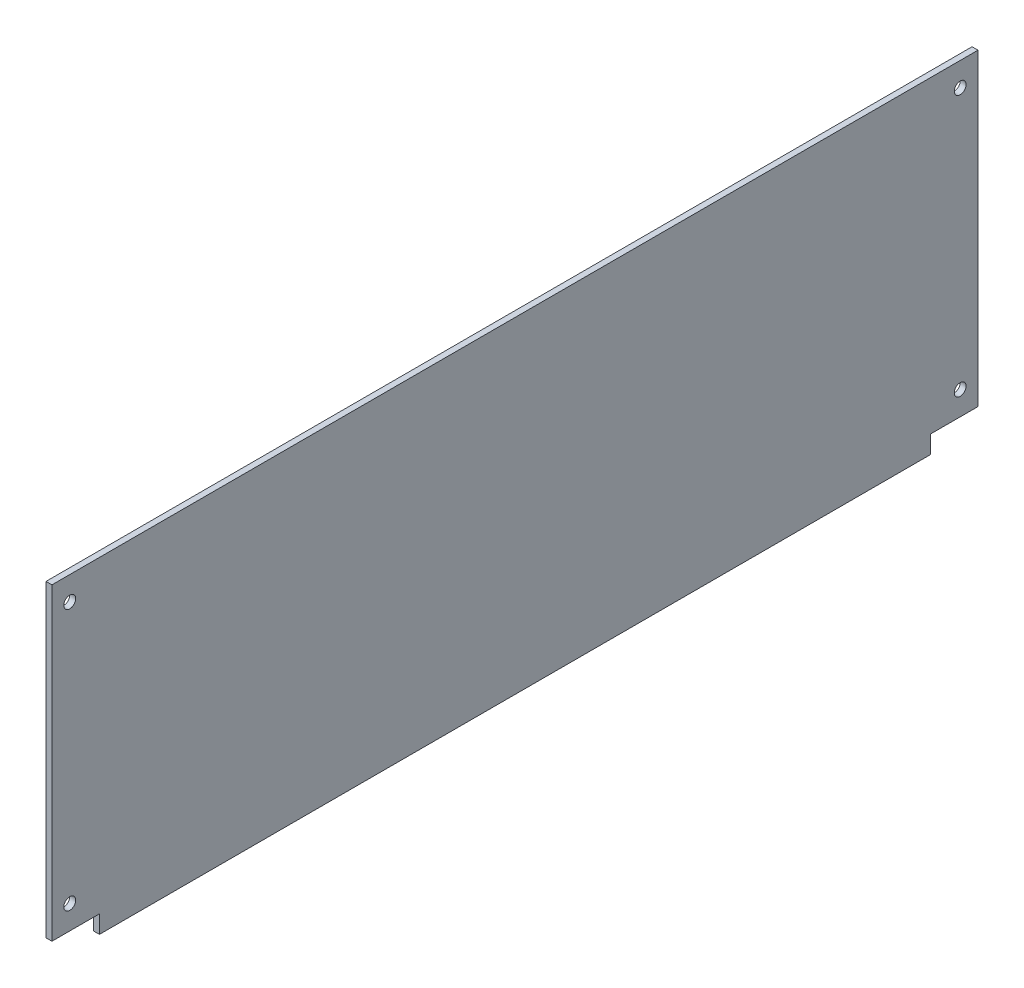
ISO-10303-21;
HEADER;
FILE_DESCRIPTION(('STEP AP214'),'2;1');
FILE_NAME('part.step','',(''),(''),'','','');
FILE_SCHEMA(('AUTOMOTIVE_DESIGN { 1 0 10303 214 1 1 1 1 }'));
ENDSEC;
DATA;
#1=APPLICATION_CONTEXT('core data for automotive mechanical design processes');
#2=APPLICATION_PROTOCOL_DEFINITION('international standard','automotive_design',2000,#1);
#3=PRODUCT_CONTEXT('',#1,'mechanical');
#4=PRODUCT('Part','Part','',(#3));
#5=PRODUCT_RELATED_PRODUCT_CATEGORY('part','',(#4));
#6=PRODUCT_DEFINITION_FORMATION('','',#4);
#7=PRODUCT_DEFINITION_CONTEXT('part definition',#1,'design');
#8=PRODUCT_DEFINITION('design','',#6,#7);
#9=PRODUCT_DEFINITION_SHAPE('','',#8);
#10=(LENGTH_UNIT() NAMED_UNIT(*) SI_UNIT(.MILLI.,.METRE.));
#11=(NAMED_UNIT(*) PLANE_ANGLE_UNIT() SI_UNIT($,.RADIAN.));
#12=(NAMED_UNIT(*) SI_UNIT($,.STERADIAN.) SOLID_ANGLE_UNIT());
#13=UNCERTAINTY_MEASURE_WITH_UNIT(LENGTH_MEASURE(1.E-05),#10,'distance_accuracy_value','');
#14=(GEOMETRIC_REPRESENTATION_CONTEXT(3) GLOBAL_UNCERTAINTY_ASSIGNED_CONTEXT((#13)) GLOBAL_UNIT_ASSIGNED_CONTEXT((#10,
#11,#12)) REPRESENTATION_CONTEXT('',''));
#15=CARTESIAN_POINT('',(0.,0.,0.));
#16=DIRECTION('',(0.,0.,1.));
#17=DIRECTION('',(1.,0.,0.));
#18=AXIS2_PLACEMENT_3D('',#15,#16,#17);
#19=CARTESIAN_POINT('',(5.,0.,700.));
#20=DIRECTION('',(0.,1.,0.));
#21=DIRECTION('',(0.,0.,1.));
#22=AXIS2_PLACEMENT_3D('',#19,#20,#21);
#23=PLANE('',#22);
#24=DIRECTION('',(1.,0.,0.));
#25=VECTOR('',#24,1.);
#26=CARTESIAN_POINT('',(5.,0.,0.));
#27=LINE('',#26,#25);
#28=CARTESIAN_POINT('',(0.,0.,0.));
#29=VERTEX_POINT('',#28);
#30=CARTESIAN_POINT('',(5.,0.,0.));
#31=VERTEX_POINT('',#30);
#32=EDGE_CURVE('E139',#29,#31,#27,.T.);
#33=ORIENTED_EDGE('',*,*,#32,.T.);
#34=DIRECTION('',(0.,0.,-1.));
#35=VECTOR('',#34,1.);
#36=CARTESIAN_POINT('',(5.,0.,700.));
#37=LINE('',#36,#35);
#38=CARTESIAN_POINT('',(5.,0.,700.));
#39=VERTEX_POINT('',#38);
#40=EDGE_CURVE('E11',#39,#31,#37,.T.);
#41=ORIENTED_EDGE('',*,*,#40,.F.);
#42=DIRECTION('',(1.,0.,0.));
#43=VECTOR('',#42,1.);
#44=CARTESIAN_POINT('',(5.,0.,700.));
#45=LINE('',#44,#43);
#46=CARTESIAN_POINT('',(0.,0.,700.));
#47=VERTEX_POINT('',#46);
#48=EDGE_CURVE('E141',#47,#39,#45,.T.);
#49=ORIENTED_EDGE('',*,*,#48,.F.);
#50=DIRECTION('',(0.,0.,-1.));
#51=VECTOR('',#50,1.);
#52=CARTESIAN_POINT('',(0.,0.,700.));
#53=LINE('',#52,#51);
#54=EDGE_CURVE('E150',#47,#29,#53,.T.);
#55=ORIENTED_EDGE('',*,*,#54,.T.);
#56=EDGE_LOOP('',(#33,#41,#49,#55));
#57=FACE_BOUND('',#56,.T.);
#58=ADVANCED_FACE('F35',(#57),#23,.F.);
#59=CARTESIAN_POINT('',(5.,0.,700.));
#60=DIRECTION('',(-1.,0.,0.));
#61=DIRECTION('',(0.,0.,1.));
#62=AXIS2_PLACEMENT_3D('',#59,#60,#61);
#63=PLANE('',#62);
#64=CARTESIAN_POINT('',(5.,255.,725.));
#65=DIRECTION('',(1.,0.,0.));
#66=DIRECTION('',(0.,0.,-1.));
#67=AXIS2_PLACEMENT_3D('',#64,#65,#66);
#68=CIRCLE('',#67,5.);
#69=CARTESIAN_POINT('',(5.,255.,720.));
#70=VERTEX_POINT('',#69);
#71=EDGE_CURVE('E188',#70,#70,#68,.T.);
#72=ORIENTED_EDGE('',*,*,#71,.F.);
#73=EDGE_LOOP('',(#72));
#74=FACE_BOUND('',#73,.T.);
#75=CARTESIAN_POINT('',(5.,35.,725.));
#76=DIRECTION('',(1.,0.,0.));
#77=DIRECTION('',(0.,0.,-1.));
#78=AXIS2_PLACEMENT_3D('',#75,#76,#77);
#79=CIRCLE('',#78,5.);
#80=CARTESIAN_POINT('',(5.,35.,720.));
#81=VERTEX_POINT('',#80);
#82=EDGE_CURVE('E199',#81,#81,#79,.T.);
#83=ORIENTED_EDGE('',*,*,#82,.F.);
#84=EDGE_LOOP('',(#83));
#85=FACE_BOUND('',#84,.T.);
#86=CARTESIAN_POINT('',(5.,255.,-25.));
#87=DIRECTION('',(-1.,0.,0.));
#88=DIRECTION('',(0.,0.,1.));
#89=AXIS2_PLACEMENT_3D('',#86,#87,#88);
#90=CIRCLE('',#89,5.);
#91=CARTESIAN_POINT('',(5.,255.,-20.));
#92=VERTEX_POINT('',#91);
#93=EDGE_CURVE('E182',#92,#92,#90,.T.);
#94=ORIENTED_EDGE('',*,*,#93,.T.);
#95=EDGE_LOOP('',(#94));
#96=FACE_BOUND('',#95,.T.);
#97=CARTESIAN_POINT('',(5.,35.,-25.));
#98=DIRECTION('',(-1.,0.,0.));
#99=DIRECTION('',(0.,0.,1.));
#100=AXIS2_PLACEMENT_3D('',#97,#98,#99);
#101=CIRCLE('',#100,5.);
#102=CARTESIAN_POINT('',(5.,35.,-20.));
#103=VERTEX_POINT('',#102);
#104=EDGE_CURVE('E187',#103,#103,#101,.T.);
#105=ORIENTED_EDGE('',*,*,#104,.T.);
#106=EDGE_LOOP('',(#105));
#107=FACE_BOUND('',#106,.T.);
#108=DIRECTION('',(0.,1.,0.));
#109=VECTOR('',#108,1.);
#110=CARTESIAN_POINT('',(5.,0.,0.));
#111=LINE('',#110,#109);
#112=CARTESIAN_POINT('',(5.,15.,0.));
#113=VERTEX_POINT('',#112);
#114=EDGE_CURVE('E153',#31,#113,#111,.T.);
#115=ORIENTED_EDGE('',*,*,#114,.T.);
#116=DIRECTION('',(0.,0.,1.));
#117=VECTOR('',#116,1.);
#118=CARTESIAN_POINT('',(5.,15.,0.));
#119=LINE('',#118,#117);
#120=CARTESIAN_POINT('',(5.,15.,-40.));
#121=VERTEX_POINT('',#120);
#122=EDGE_CURVE('E128',#121,#113,#119,.T.);
#123=ORIENTED_EDGE('',*,*,#122,.F.);
#124=DIRECTION('',(0.,-1.,0.));
#125=VECTOR('',#124,1.);
#126=CARTESIAN_POINT('',(5.,275.,-40.));
#127=LINE('',#126,#125);
#128=CARTESIAN_POINT('',(5.,275.,-40.));
#129=VERTEX_POINT('',#128);
#130=EDGE_CURVE('E106',#129,#121,#127,.T.);
#131=ORIENTED_EDGE('',*,*,#130,.F.);
#132=DIRECTION('',(0.,0.,-1.));
#133=VECTOR('',#132,1.);
#134=CARTESIAN_POINT('',(5.,275.,700.));
#135=LINE('',#134,#133);
#136=CARTESIAN_POINT('',(5.,275.,740.));
#137=VERTEX_POINT('',#136);
#138=EDGE_CURVE('E42',#137,#129,#135,.T.);
#139=ORIENTED_EDGE('',*,*,#138,.F.);
#140=DIRECTION('',(0.,-1.,0.));
#141=VECTOR('',#140,1.);
#142=CARTESIAN_POINT('',(5.,275.,740.));
#143=LINE('',#142,#141);
#144=CARTESIAN_POINT('',(5.,15.,740.));
#145=VERTEX_POINT('',#144);
#146=EDGE_CURVE('E103',#137,#145,#143,.T.);
#147=ORIENTED_EDGE('',*,*,#146,.T.);
#148=DIRECTION('',(0.,0.,-1.));
#149=VECTOR('',#148,1.);
#150=CARTESIAN_POINT('',(5.,15.,700.));
#151=LINE('',#150,#149);
#152=CARTESIAN_POINT('',(5.,15.,700.));
#153=VERTEX_POINT('',#152);
#154=EDGE_CURVE('E174',#145,#153,#151,.T.);
#155=ORIENTED_EDGE('',*,*,#154,.T.);
#156=DIRECTION('',(0.,1.,0.));
#157=VECTOR('',#156,1.);
#158=CARTESIAN_POINT('',(5.,0.,700.));
#159=LINE('',#158,#157);
#160=EDGE_CURVE('E144',#39,#153,#159,.T.);
#161=ORIENTED_EDGE('',*,*,#160,.F.);
#162=ORIENTED_EDGE('',*,*,#40,.T.);
#163=EDGE_LOOP('',(#115,#123,#131,#139,#147,#155,#161,#162));
#164=FACE_BOUND('',#163,.T.);
#165=ADVANCED_FACE('F101',(#74,#85,#96,#107,#164),#63,.F.);
#166=CARTESIAN_POINT('',(5.,275.,700.));
#167=DIRECTION('',(0.,-1.,0.));
#168=DIRECTION('',(0.,0.,-1.));
#169=AXIS2_PLACEMENT_3D('',#166,#167,#168);
#170=PLANE('',#169);
#171=ORIENTED_EDGE('',*,*,#138,.T.);
#172=DIRECTION('',(1.,0.,0.));
#173=VECTOR('',#172,1.);
#174=CARTESIAN_POINT('',(5.,275.,-40.));
#175=LINE('',#174,#173);
#176=CARTESIAN_POINT('',(0.,275.,-40.));
#177=VERTEX_POINT('',#176);
#178=EDGE_CURVE('E125',#177,#129,#175,.T.);
#179=ORIENTED_EDGE('',*,*,#178,.F.);
#180=DIRECTION('',(0.,0.,-1.));
#181=VECTOR('',#180,1.);
#182=CARTESIAN_POINT('',(0.,275.,700.));
#183=LINE('',#182,#181);
#184=CARTESIAN_POINT('',(0.,275.,740.));
#185=VERTEX_POINT('',#184);
#186=EDGE_CURVE('E110',#185,#177,#183,.T.);
#187=ORIENTED_EDGE('',*,*,#186,.F.);
#188=DIRECTION('',(1.,0.,0.));
#189=VECTOR('',#188,1.);
#190=CARTESIAN_POINT('',(5.,275.,740.));
#191=LINE('',#190,#189);
#192=EDGE_CURVE('E112',#185,#137,#191,.T.);
#193=ORIENTED_EDGE('',*,*,#192,.T.);
#194=EDGE_LOOP('',(#171,#179,#187,#193));
#195=FACE_BOUND('',#194,.T.);
#196=ADVANCED_FACE('F113',(#195),#170,.F.);
#197=CARTESIAN_POINT('',(0.,0.,700.));
#198=DIRECTION('',(1.,0.,0.));
#199=DIRECTION('',(0.,0.,-1.));
#200=AXIS2_PLACEMENT_3D('',#197,#198,#199);
#201=PLANE('',#200);
#202=CARTESIAN_POINT('',(0.,255.,725.));
#203=DIRECTION('',(1.,0.,0.));
#204=DIRECTION('',(0.,0.,-1.));
#205=AXIS2_PLACEMENT_3D('',#202,#203,#204);
#206=CIRCLE('',#205,5.);
#207=CARTESIAN_POINT('',(0.,255.,720.));
#208=VERTEX_POINT('',#207);
#209=EDGE_CURVE('E202',#208,#208,#206,.T.);
#210=ORIENTED_EDGE('',*,*,#209,.T.);
#211=EDGE_LOOP('',(#210));
#212=FACE_BOUND('',#211,.T.);
#213=CARTESIAN_POINT('',(0.,35.,725.));
#214=DIRECTION('',(1.,0.,0.));
#215=DIRECTION('',(0.,0.,-1.));
#216=AXIS2_PLACEMENT_3D('',#213,#214,#215);
#217=CIRCLE('',#216,5.);
#218=CARTESIAN_POINT('',(0.,35.,720.));
#219=VERTEX_POINT('',#218);
#220=EDGE_CURVE('E196',#219,#219,#217,.T.);
#221=ORIENTED_EDGE('',*,*,#220,.T.);
#222=EDGE_LOOP('',(#221));
#223=FACE_BOUND('',#222,.T.);
#224=CARTESIAN_POINT('',(0.,255.,-25.));
#225=DIRECTION('',(-1.,0.,0.));
#226=DIRECTION('',(0.,0.,1.));
#227=AXIS2_PLACEMENT_3D('',#224,#225,#226);
#228=CIRCLE('',#227,5.);
#229=CARTESIAN_POINT('',(0.,255.,-20.));
#230=VERTEX_POINT('',#229);
#231=EDGE_CURVE('E191',#230,#230,#228,.T.);
#232=ORIENTED_EDGE('',*,*,#231,.F.);
#233=EDGE_LOOP('',(#232));
#234=FACE_BOUND('',#233,.T.);
#235=CARTESIAN_POINT('',(0.,35.,-25.));
#236=DIRECTION('',(-1.,0.,0.));
#237=DIRECTION('',(0.,0.,1.));
#238=AXIS2_PLACEMENT_3D('',#235,#236,#237);
#239=CIRCLE('',#238,5.);
#240=CARTESIAN_POINT('',(0.,35.,-20.));
#241=VERTEX_POINT('',#240);
#242=EDGE_CURVE('E184',#241,#241,#239,.T.);
#243=ORIENTED_EDGE('',*,*,#242,.F.);
#244=EDGE_LOOP('',(#243));
#245=FACE_BOUND('',#244,.T.);
#246=ORIENTED_EDGE('',*,*,#186,.T.);
#247=DIRECTION('',(0.,-1.,0.));
#248=VECTOR('',#247,1.);
#249=CARTESIAN_POINT('',(0.,275.,-40.));
#250=LINE('',#249,#248);
#251=CARTESIAN_POINT('',(0.,15.,-40.));
#252=VERTEX_POINT('',#251);
#253=EDGE_CURVE('E127',#177,#252,#250,.T.);
#254=ORIENTED_EDGE('',*,*,#253,.T.);
#255=DIRECTION('',(0.,0.,-1.));
#256=VECTOR('',#255,1.);
#257=CARTESIAN_POINT('',(0.,15.,-40.));
#258=LINE('',#257,#256);
#259=CARTESIAN_POINT('',(0.,15.,0.));
#260=VERTEX_POINT('',#259);
#261=EDGE_CURVE('E130',#260,#252,#258,.T.);
#262=ORIENTED_EDGE('',*,*,#261,.F.);
#263=DIRECTION('',(0.,-1.,0.));
#264=VECTOR('',#263,1.);
#265=CARTESIAN_POINT('',(0.,0.,0.));
#266=LINE('',#265,#264);
#267=EDGE_CURVE('E145',#260,#29,#266,.T.);
#268=ORIENTED_EDGE('',*,*,#267,.T.);
#269=ORIENTED_EDGE('',*,*,#54,.F.);
#270=DIRECTION('',(0.,-1.,0.));
#271=VECTOR('',#270,1.);
#272=CARTESIAN_POINT('',(0.,0.,700.));
#273=LINE('',#272,#271);
#274=CARTESIAN_POINT('',(0.,15.,700.));
#275=VERTEX_POINT('',#274);
#276=EDGE_CURVE('E148',#275,#47,#273,.T.);
#277=ORIENTED_EDGE('',*,*,#276,.F.);
#278=DIRECTION('',(0.,0.,1.));
#279=VECTOR('',#278,1.);
#280=CARTESIAN_POINT('',(0.,15.,740.));
#281=LINE('',#280,#279);
#282=CARTESIAN_POINT('',(0.,15.,740.));
#283=VERTEX_POINT('',#282);
#284=EDGE_CURVE('E49',#275,#283,#281,.T.);
#285=ORIENTED_EDGE('',*,*,#284,.T.);
#286=DIRECTION('',(0.,-1.,0.));
#287=VECTOR('',#286,1.);
#288=CARTESIAN_POINT('',(0.,275.,740.));
#289=LINE('',#288,#287);
#290=EDGE_CURVE('E120',#185,#283,#289,.T.);
#291=ORIENTED_EDGE('',*,*,#290,.F.);
#292=EDGE_LOOP('',(#246,#254,#262,#268,#269,#277,#285,#291));
#293=FACE_BOUND('',#292,.T.);
#294=ADVANCED_FACE('F160',(#212,#223,#234,#245,#293),#201,.F.);
#295=CARTESIAN_POINT('',(0.,0.,700.));
#296=DIRECTION('',(0.,0.,-1.));
#297=DIRECTION('',(-1.,0.,0.));
#298=AXIS2_PLACEMENT_3D('',#295,#296,#297);
#299=PLANE('',#298);
#300=ORIENTED_EDGE('',*,*,#160,.T.);
#301=DIRECTION('',(-1.,0.,0.));
#302=VECTOR('',#301,1.);
#303=CARTESIAN_POINT('',(0.,15.,700.));
#304=LINE('',#303,#302);
#305=EDGE_CURVE('E177',#153,#275,#304,.T.);
#306=ORIENTED_EDGE('',*,*,#305,.T.);
#307=ORIENTED_EDGE('',*,*,#276,.T.);
#308=ORIENTED_EDGE('',*,*,#48,.T.);
#309=EDGE_LOOP('',(#300,#306,#307,#308));
#310=FACE_BOUND('',#309,.T.);
#311=ADVANCED_FACE('F176',(#310),#299,.F.);
#312=CARTESIAN_POINT('',(0.,0.,0.));
#313=DIRECTION('',(0.,0.,-1.));
#314=DIRECTION('',(-1.,0.,0.));
#315=AXIS2_PLACEMENT_3D('',#312,#313,#314);
#316=PLANE('',#315);
#317=DIRECTION('',(-1.,0.,0.));
#318=VECTOR('',#317,1.);
#319=CARTESIAN_POINT('',(0.,15.,0.));
#320=LINE('',#319,#318);
#321=EDGE_CURVE('E57',#113,#260,#320,.T.);
#322=ORIENTED_EDGE('',*,*,#321,.F.);
#323=ORIENTED_EDGE('',*,*,#114,.F.);
#324=ORIENTED_EDGE('',*,*,#32,.F.);
#325=ORIENTED_EDGE('',*,*,#267,.F.);
#326=EDGE_LOOP('',(#322,#323,#324,#325));
#327=FACE_BOUND('',#326,.T.);
#328=ADVANCED_FACE('F173',(#327),#316,.T.);
#329=CARTESIAN_POINT('',(5.,275.,-40.));
#330=DIRECTION('',(0.,0.,-1.));
#331=DIRECTION('',(-1.,0.,0.));
#332=AXIS2_PLACEMENT_3D('',#329,#330,#331);
#333=PLANE('',#332);
#334=DIRECTION('',(1.,0.,0.));
#335=VECTOR('',#334,1.);
#336=CARTESIAN_POINT('',(5.,15.,-40.));
#337=LINE('',#336,#335);
#338=EDGE_CURVE('E133',#252,#121,#337,.T.);
#339=ORIENTED_EDGE('',*,*,#338,.F.);
#340=ORIENTED_EDGE('',*,*,#253,.F.);
#341=ORIENTED_EDGE('',*,*,#178,.T.);
#342=ORIENTED_EDGE('',*,*,#130,.T.);
#343=EDGE_LOOP('',(#339,#340,#341,#342));
#344=FACE_BOUND('',#343,.T.);
#345=ADVANCED_FACE('F164',(#344),#333,.T.);
#346=CARTESIAN_POINT('',(0.,15.,0.));
#347=DIRECTION('',(0.,1.,0.));
#348=DIRECTION('',(0.,0.,1.));
#349=AXIS2_PLACEMENT_3D('',#346,#347,#348);
#350=PLANE('',#349);
#351=ORIENTED_EDGE('',*,*,#321,.T.);
#352=ORIENTED_EDGE('',*,*,#261,.T.);
#353=ORIENTED_EDGE('',*,*,#338,.T.);
#354=ORIENTED_EDGE('',*,*,#122,.T.);
#355=EDGE_LOOP('',(#351,#352,#353,#354));
#356=FACE_BOUND('',#355,.T.);
#357=ADVANCED_FACE('F166',(#356),#350,.F.);
#358=CARTESIAN_POINT('',(5.,275.,740.));
#359=DIRECTION('',(0.,0.,-1.));
#360=DIRECTION('',(-1.,0.,0.));
#361=AXIS2_PLACEMENT_3D('',#358,#359,#360);
#362=PLANE('',#361);
#363=DIRECTION('',(1.,0.,0.));
#364=VECTOR('',#363,1.);
#365=CARTESIAN_POINT('',(5.,15.,740.));
#366=LINE('',#365,#364);
#367=EDGE_CURVE('E119',#283,#145,#366,.T.);
#368=ORIENTED_EDGE('',*,*,#367,.T.);
#369=ORIENTED_EDGE('',*,*,#146,.F.);
#370=ORIENTED_EDGE('',*,*,#192,.F.);
#371=ORIENTED_EDGE('',*,*,#290,.T.);
#372=EDGE_LOOP('',(#368,#369,#370,#371));
#373=FACE_BOUND('',#372,.T.);
#374=ADVANCED_FACE('F118',(#373),#362,.F.);
#375=CARTESIAN_POINT('',(0.,15.,700.));
#376=DIRECTION('',(0.,1.,0.));
#377=DIRECTION('',(0.,0.,-1.));
#378=AXIS2_PLACEMENT_3D('',#375,#376,#377);
#379=PLANE('',#378);
#380=ORIENTED_EDGE('',*,*,#305,.F.);
#381=ORIENTED_EDGE('',*,*,#154,.F.);
#382=ORIENTED_EDGE('',*,*,#367,.F.);
#383=ORIENTED_EDGE('',*,*,#284,.F.);
#384=EDGE_LOOP('',(#380,#381,#382,#383));
#385=FACE_BOUND('',#384,.T.);
#386=ADVANCED_FACE('F178',(#385),#379,.F.);
#387=CARTESIAN_POINT('',(5.,35.,-25.));
#388=DIRECTION('',(-1.,0.,0.));
#389=DIRECTION('',(0.,0.,1.));
#390=AXIS2_PLACEMENT_3D('',#387,#388,#389);
#391=CYLINDRICAL_SURFACE('',#390,5.);
#392=ORIENTED_EDGE('',*,*,#104,.F.);
#393=EDGE_LOOP('',(#392));
#394=FACE_BOUND('',#393,.T.);
#395=ORIENTED_EDGE('',*,*,#242,.T.);
#396=EDGE_LOOP('',(#395));
#397=FACE_BOUND('',#396,.T.);
#398=ADVANCED_FACE('F219',(#394,#397),#391,.F.);
#399=CARTESIAN_POINT('',(5.,255.,-25.));
#400=DIRECTION('',(-1.,0.,0.));
#401=DIRECTION('',(0.,0.,1.));
#402=AXIS2_PLACEMENT_3D('',#399,#400,#401);
#403=CYLINDRICAL_SURFACE('',#402,5.);
#404=ORIENTED_EDGE('',*,*,#93,.F.);
#405=EDGE_LOOP('',(#404));
#406=FACE_BOUND('',#405,.T.);
#407=ORIENTED_EDGE('',*,*,#231,.T.);
#408=EDGE_LOOP('',(#407));
#409=FACE_BOUND('',#408,.T.);
#410=ADVANCED_FACE('F222',(#406,#409),#403,.F.);
#411=CARTESIAN_POINT('',(5.,35.,725.));
#412=DIRECTION('',(-1.,0.,0.));
#413=DIRECTION('',(0.,0.,1.));
#414=AXIS2_PLACEMENT_3D('',#411,#412,#413);
#415=CYLINDRICAL_SURFACE('',#414,5.);
#416=ORIENTED_EDGE('',*,*,#82,.T.);
#417=EDGE_LOOP('',(#416));
#418=FACE_BOUND('',#417,.T.);
#419=ORIENTED_EDGE('',*,*,#220,.F.);
#420=EDGE_LOOP('',(#419));
#421=FACE_BOUND('',#420,.T.);
#422=ADVANCED_FACE('F295',(#418,#421),#415,.F.);
#423=CARTESIAN_POINT('',(5.,255.,725.));
#424=DIRECTION('',(-1.,0.,0.));
#425=DIRECTION('',(0.,0.,1.));
#426=AXIS2_PLACEMENT_3D('',#423,#424,#425);
#427=CYLINDRICAL_SURFACE('',#426,5.);
#428=ORIENTED_EDGE('',*,*,#71,.T.);
#429=EDGE_LOOP('',(#428));
#430=FACE_BOUND('',#429,.T.);
#431=ORIENTED_EDGE('',*,*,#209,.F.);
#432=EDGE_LOOP('',(#431));
#433=FACE_BOUND('',#432,.T.);
#434=ADVANCED_FACE('F208',(#430,#433),#427,.F.);
#435=CLOSED_SHELL('',(#58,#165,#196,#294,#311,#328,#345,#357,#374,#386,#398,#410,#422,#434));
#436=MANIFOLD_SOLID_BREP('B2',#435);
#437=ADVANCED_BREP_SHAPE_REPRESENTATION('',(#18,#436),#14);
#438=SHAPE_DEFINITION_REPRESENTATION(#9,#437);
ENDSEC;
END-ISO-10303-21;
